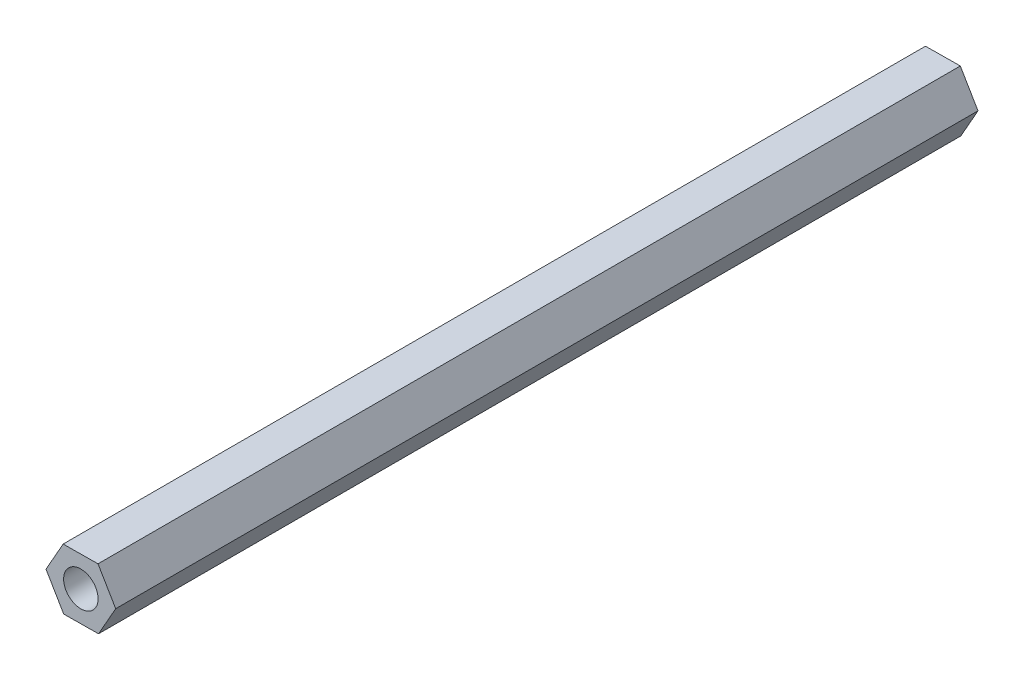
ISO-10303-21;
HEADER;
FILE_DESCRIPTION(('STEP AP214'),'2;1');
FILE_NAME('part.step','',(''),(''),'','','');
FILE_SCHEMA(('AUTOMOTIVE_DESIGN { 1 0 10303 214 1 1 1 1 }'));
ENDSEC;
DATA;
#1=APPLICATION_CONTEXT('core data for automotive mechanical design processes');
#2=APPLICATION_PROTOCOL_DEFINITION('international standard','automotive_design',2000,#1);
#3=PRODUCT_CONTEXT('',#1,'mechanical');
#4=PRODUCT('Part','Part','',(#3));
#5=PRODUCT_RELATED_PRODUCT_CATEGORY('part','',(#4));
#6=PRODUCT_DEFINITION_FORMATION('','',#4);
#7=PRODUCT_DEFINITION_CONTEXT('part definition',#1,'design');
#8=PRODUCT_DEFINITION('design','',#6,#7);
#9=PRODUCT_DEFINITION_SHAPE('','',#8);
#10=(LENGTH_UNIT() NAMED_UNIT(*) SI_UNIT(.MILLI.,.METRE.));
#11=(NAMED_UNIT(*) PLANE_ANGLE_UNIT() SI_UNIT($,.RADIAN.));
#12=(NAMED_UNIT(*) SI_UNIT($,.STERADIAN.) SOLID_ANGLE_UNIT());
#13=UNCERTAINTY_MEASURE_WITH_UNIT(LENGTH_MEASURE(1.E-05),#10,'distance_accuracy_value','');
#14=(GEOMETRIC_REPRESENTATION_CONTEXT(3) GLOBAL_UNCERTAINTY_ASSIGNED_CONTEXT((#13)) GLOBAL_UNIT_ASSIGNED_CONTEXT((#10,
#11,#12)) REPRESENTATION_CONTEXT('',''));
#15=CARTESIAN_POINT('',(0.,0.,0.));
#16=DIRECTION('',(0.,0.,1.));
#17=DIRECTION('',(1.,0.,0.));
#18=AXIS2_PLACEMENT_3D('',#15,#16,#17);
#19=CARTESIAN_POINT('',(0.,0.,100.));
#20=DIRECTION('',(0.,0.,1.));
#21=DIRECTION('',(1.,0.,0.));
#22=AXIS2_PLACEMENT_3D('',#19,#20,#21);
#23=PLANE('',#22);
#24=DIRECTION('',(0.999961257640527,0.00880245522430722,0.));
#25=VECTOR('',#24,1.);
#26=CARTESIAN_POINT('',(-1.98983906118775,-3.51765175136834,100.));
#27=LINE('',#26,#25);
#28=CARTESIAN_POINT('',(-1.98983906118775,-3.51765175136834,100.));
#29=VERTEX_POINT('',#28);
#30=CARTESIAN_POINT('',(2.05145624775792,-3.48207705211536,100.));
#31=VERTEX_POINT('',#30);
#32=EDGE_CURVE('E146',#29,#31,#27,.T.);
#33=ORIENTED_EDGE('',*,*,#32,.T.);
#34=DIRECTION('',(0.492357478980338,0.870393079529086,0.));
#35=VECTOR('',#34,1.);
#36=CARTESIAN_POINT('',(2.05145624775792,-3.48207705211536,100.));
#37=LINE('',#36,#35);
#38=CARTESIAN_POINT('',(4.04129530894568,0.0355746992529791,100.));
#39=VERTEX_POINT('',#38);
#40=EDGE_CURVE('E94',#31,#39,#37,.T.);
#41=ORIENTED_EDGE('',*,*,#40,.T.);
#42=DIRECTION('',(-0.507603778660189,0.861590624304779,0.));
#43=VECTOR('',#42,1.);
#44=CARTESIAN_POINT('',(4.04129530894568,0.0355746992529791,100.));
#45=LINE('',#44,#43);
#46=CARTESIAN_POINT('',(1.98983906118776,3.51765175136834,100.));
#47=VERTEX_POINT('',#46);
#48=EDGE_CURVE('E107',#39,#47,#45,.T.);
#49=ORIENTED_EDGE('',*,*,#48,.T.);
#50=DIRECTION('',(-0.999961257640527,-0.00880245522430723,0.));
#51=VECTOR('',#50,1.);
#52=CARTESIAN_POINT('',(1.98983906118776,3.51765175136834,100.));
#53=LINE('',#52,#51);
#54=CARTESIAN_POINT('',(-2.05145624775791,3.48207705211536,100.));
#55=VERTEX_POINT('',#54);
#56=EDGE_CURVE('E101',#47,#55,#53,.T.);
#57=ORIENTED_EDGE('',*,*,#56,.T.);
#58=DIRECTION('',(-0.492357478980338,-0.870393079529086,0.));
#59=VECTOR('',#58,1.);
#60=CARTESIAN_POINT('',(-2.05145624775791,3.48207705211536,100.));
#61=LINE('',#60,#59);
#62=CARTESIAN_POINT('',(-4.04129530894568,-0.0355746992529825,100.));
#63=VERTEX_POINT('',#62);
#64=EDGE_CURVE('E105',#55,#63,#61,.T.);
#65=ORIENTED_EDGE('',*,*,#64,.T.);
#66=DIRECTION('',(0.507603778660189,-0.861590624304779,0.));
#67=VECTOR('',#66,1.);
#68=CARTESIAN_POINT('',(-4.04129530894568,-0.0355746992529825,100.));
#69=LINE('',#68,#67);
#70=EDGE_CURVE('E57',#63,#29,#69,.T.);
#71=ORIENTED_EDGE('',*,*,#70,.T.);
#72=EDGE_LOOP('',(#33,#41,#49,#57,#65,#71));
#73=FACE_BOUND('',#72,.T.);
#74=CARTESIAN_POINT('',(0.,0.,100.));
#75=DIRECTION('',(0.,0.,1.));
#76=DIRECTION('',(1.,0.,0.));
#77=AXIS2_PLACEMENT_3D('',#74,#75,#76);
#78=CIRCLE('',#77,2.);
#79=CARTESIAN_POINT('',(2.,0.,100.));
#80=VERTEX_POINT('',#79);
#81=EDGE_CURVE('E134',#80,#80,#78,.T.);
#82=ORIENTED_EDGE('',*,*,#81,.F.);
#83=EDGE_LOOP('',(#82));
#84=FACE_BOUND('',#83,.T.);
#85=ADVANCED_FACE('F39',(#73,#84),#23,.T.);
#86=CARTESIAN_POINT('',(0.,0.,0.));
#87=DIRECTION('',(0.,0.,1.));
#88=DIRECTION('',(1.,0.,0.));
#89=AXIS2_PLACEMENT_3D('',#86,#87,#88);
#90=PLANE('',#89);
#91=DIRECTION('',(0.999961257640527,0.00880245522430722,0.));
#92=VECTOR('',#91,1.);
#93=CARTESIAN_POINT('',(-1.98983906118775,-3.51765175136834,0.));
#94=LINE('',#93,#92);
#95=CARTESIAN_POINT('',(-1.98983906118775,-3.51765175136834,0.));
#96=VERTEX_POINT('',#95);
#97=CARTESIAN_POINT('',(2.05145624775792,-3.48207705211536,0.));
#98=VERTEX_POINT('',#97);
#99=EDGE_CURVE('E129',#96,#98,#94,.T.);
#100=ORIENTED_EDGE('',*,*,#99,.F.);
#101=DIRECTION('',(0.507603778660189,-0.861590624304779,0.));
#102=VECTOR('',#101,1.);
#103=CARTESIAN_POINT('',(-4.04129530894568,-0.0355746992529825,0.));
#104=LINE('',#103,#102);
#105=CARTESIAN_POINT('',(-4.04129530894568,-0.0355746992529825,0.));
#106=VERTEX_POINT('',#105);
#107=EDGE_CURVE('E86',#106,#96,#104,.T.);
#108=ORIENTED_EDGE('',*,*,#107,.F.);
#109=DIRECTION('',(-0.492357478980338,-0.870393079529086,0.));
#110=VECTOR('',#109,1.);
#111=CARTESIAN_POINT('',(-2.05145624775791,3.48207705211536,0.));
#112=LINE('',#111,#110);
#113=CARTESIAN_POINT('',(-2.05145624775791,3.48207705211536,0.));
#114=VERTEX_POINT('',#113);
#115=EDGE_CURVE('E80',#114,#106,#112,.T.);
#116=ORIENTED_EDGE('',*,*,#115,.F.);
#117=DIRECTION('',(-0.999961257640527,-0.00880245522430723,0.));
#118=VECTOR('',#117,1.);
#119=CARTESIAN_POINT('',(1.98983906118776,3.51765175136834,0.));
#120=LINE('',#119,#118);
#121=CARTESIAN_POINT('',(1.98983906118776,3.51765175136834,0.));
#122=VERTEX_POINT('',#121);
#123=EDGE_CURVE('E116',#122,#114,#120,.T.);
#124=ORIENTED_EDGE('',*,*,#123,.F.);
#125=DIRECTION('',(-0.507603778660189,0.861590624304779,0.));
#126=VECTOR('',#125,1.);
#127=CARTESIAN_POINT('',(4.04129530894568,0.0355746992529791,0.));
#128=LINE('',#127,#126);
#129=CARTESIAN_POINT('',(4.04129530894568,0.0355746992529791,0.));
#130=VERTEX_POINT('',#129);
#131=EDGE_CURVE('E137',#130,#122,#128,.T.);
#132=ORIENTED_EDGE('',*,*,#131,.F.);
#133=DIRECTION('',(0.492357478980338,0.870393079529086,0.));
#134=VECTOR('',#133,1.);
#135=CARTESIAN_POINT('',(2.05145624775792,-3.48207705211536,0.));
#136=LINE('',#135,#134);
#137=EDGE_CURVE('E133',#98,#130,#136,.T.);
#138=ORIENTED_EDGE('',*,*,#137,.F.);
#139=EDGE_LOOP('',(#100,#108,#116,#124,#132,#138));
#140=FACE_BOUND('',#139,.T.);
#141=CARTESIAN_POINT('',(0.,0.,0.));
#142=DIRECTION('',(0.,0.,1.));
#143=DIRECTION('',(1.,0.,0.));
#144=AXIS2_PLACEMENT_3D('',#141,#142,#143);
#145=CIRCLE('',#144,2.);
#146=CARTESIAN_POINT('',(2.,0.,0.));
#147=VERTEX_POINT('',#146);
#148=EDGE_CURVE('E243',#147,#147,#145,.T.);
#149=ORIENTED_EDGE('',*,*,#148,.T.);
#150=EDGE_LOOP('',(#149));
#151=FACE_BOUND('',#150,.T.);
#152=ADVANCED_FACE('F159',(#140,#151),#90,.F.);
#153=CARTESIAN_POINT('',(-1.98983906118775,-3.51765175136834,100.));
#154=DIRECTION('',(-0.00880245522430722,0.999961257640527,0.));
#155=DIRECTION('',(-0.999961257640527,-0.00880245522430722,0.));
#156=AXIS2_PLACEMENT_3D('',#153,#154,#155);
#157=PLANE('',#156);
#158=ORIENTED_EDGE('',*,*,#99,.T.);
#159=DIRECTION('',(0.,0.,-1.));
#160=VECTOR('',#159,1.);
#161=CARTESIAN_POINT('',(2.05145624775792,-3.48207705211536,100.));
#162=LINE('',#161,#160);
#163=EDGE_CURVE('E11',#31,#98,#162,.T.);
#164=ORIENTED_EDGE('',*,*,#163,.F.);
#165=ORIENTED_EDGE('',*,*,#32,.F.);
#166=DIRECTION('',(0.,0.,-1.));
#167=VECTOR('',#166,1.);
#168=CARTESIAN_POINT('',(-1.98983906118775,-3.51765175136834,100.));
#169=LINE('',#168,#167);
#170=EDGE_CURVE('E125',#29,#96,#169,.T.);
#171=ORIENTED_EDGE('',*,*,#170,.T.);
#172=EDGE_LOOP('',(#158,#164,#165,#171));
#173=FACE_BOUND('',#172,.T.);
#174=ADVANCED_FACE('F41',(#173),#157,.F.);
#175=CARTESIAN_POINT('',(2.05145624775792,-3.48207705211536,100.));
#176=DIRECTION('',(-0.870393079529086,0.492357478980338,0.));
#177=DIRECTION('',(-0.492357478980338,-0.870393079529086,0.));
#178=AXIS2_PLACEMENT_3D('',#175,#176,#177);
#179=PLANE('',#178);
#180=ORIENTED_EDGE('',*,*,#137,.T.);
#181=DIRECTION('',(0.,0.,-1.));
#182=VECTOR('',#181,1.);
#183=CARTESIAN_POINT('',(4.04129530894568,0.0355746992529791,100.));
#184=LINE('',#183,#182);
#185=EDGE_CURVE('E49',#39,#130,#184,.T.);
#186=ORIENTED_EDGE('',*,*,#185,.F.);
#187=ORIENTED_EDGE('',*,*,#40,.F.);
#188=ORIENTED_EDGE('',*,*,#163,.T.);
#189=EDGE_LOOP('',(#180,#186,#187,#188));
#190=FACE_BOUND('',#189,.T.);
#191=ADVANCED_FACE('F184',(#190),#179,.F.);
#192=CARTESIAN_POINT('',(4.04129530894568,0.0355746992529791,100.));
#193=DIRECTION('',(-0.861590624304779,-0.507603778660189,0.));
#194=DIRECTION('',(0.507603778660189,-0.861590624304779,0.));
#195=AXIS2_PLACEMENT_3D('',#192,#193,#194);
#196=PLANE('',#195);
#197=ORIENTED_EDGE('',*,*,#131,.T.);
#198=DIRECTION('',(0.,0.,-1.));
#199=VECTOR('',#198,1.);
#200=CARTESIAN_POINT('',(1.98983906118776,3.51765175136834,100.));
#201=LINE('',#200,#199);
#202=EDGE_CURVE('E118',#47,#122,#201,.T.);
#203=ORIENTED_EDGE('',*,*,#202,.F.);
#204=ORIENTED_EDGE('',*,*,#48,.F.);
#205=ORIENTED_EDGE('',*,*,#185,.T.);
#206=EDGE_LOOP('',(#197,#203,#204,#205));
#207=FACE_BOUND('',#206,.T.);
#208=ADVANCED_FACE('F156',(#207),#196,.F.);
#209=CARTESIAN_POINT('',(1.98983906118776,3.51765175136834,100.));
#210=DIRECTION('',(0.00880245522430723,-0.999961257640527,0.));
#211=DIRECTION('',(0.999961257640527,0.00880245522430723,0.));
#212=AXIS2_PLACEMENT_3D('',#209,#210,#211);
#213=PLANE('',#212);
#214=ORIENTED_EDGE('',*,*,#123,.T.);
#215=DIRECTION('',(0.,0.,-1.));
#216=VECTOR('',#215,1.);
#217=CARTESIAN_POINT('',(-2.05145624775791,3.48207705211536,100.));
#218=LINE('',#217,#216);
#219=EDGE_CURVE('E113',#55,#114,#218,.T.);
#220=ORIENTED_EDGE('',*,*,#219,.F.);
#221=ORIENTED_EDGE('',*,*,#56,.F.);
#222=ORIENTED_EDGE('',*,*,#202,.T.);
#223=EDGE_LOOP('',(#214,#220,#221,#222));
#224=FACE_BOUND('',#223,.T.);
#225=ADVANCED_FACE('F114',(#224),#213,.F.);
#226=CARTESIAN_POINT('',(-2.05145624775791,3.48207705211536,100.));
#227=DIRECTION('',(0.870393079529086,-0.492357478980338,0.));
#228=DIRECTION('',(0.492357478980338,0.870393079529086,0.));
#229=AXIS2_PLACEMENT_3D('',#226,#227,#228);
#230=PLANE('',#229);
#231=ORIENTED_EDGE('',*,*,#115,.T.);
#232=DIRECTION('',(0.,0.,-1.));
#233=VECTOR('',#232,1.);
#234=CARTESIAN_POINT('',(-4.04129530894568,-0.0355746992529825,100.));
#235=LINE('',#234,#233);
#236=EDGE_CURVE('E119',#63,#106,#235,.T.);
#237=ORIENTED_EDGE('',*,*,#236,.F.);
#238=ORIENTED_EDGE('',*,*,#64,.F.);
#239=ORIENTED_EDGE('',*,*,#219,.T.);
#240=EDGE_LOOP('',(#231,#237,#238,#239));
#241=FACE_BOUND('',#240,.T.);
#242=ADVANCED_FACE('F121',(#241),#230,.F.);
#243=CARTESIAN_POINT('',(-4.04129530894568,-0.0355746992529825,100.));
#244=DIRECTION('',(0.861590624304779,0.507603778660189,0.));
#245=DIRECTION('',(-0.507603778660189,0.861590624304779,0.));
#246=AXIS2_PLACEMENT_3D('',#243,#244,#245);
#247=PLANE('',#246);
#248=ORIENTED_EDGE('',*,*,#107,.T.);
#249=ORIENTED_EDGE('',*,*,#170,.F.);
#250=ORIENTED_EDGE('',*,*,#70,.F.);
#251=ORIENTED_EDGE('',*,*,#236,.T.);
#252=EDGE_LOOP('',(#248,#249,#250,#251));
#253=FACE_BOUND('',#252,.T.);
#254=ADVANCED_FACE('F164',(#253),#247,.F.);
#255=CARTESIAN_POINT('',(0.,0.,100.));
#256=DIRECTION('',(0.,0.,-1.));
#257=DIRECTION('',(-1.,0.,0.));
#258=AXIS2_PLACEMENT_3D('',#255,#256,#257);
#259=CYLINDRICAL_SURFACE('',#258,2.);
#260=ORIENTED_EDGE('',*,*,#81,.T.);
#261=EDGE_LOOP('',(#260));
#262=FACE_BOUND('',#261,.T.);
#263=ORIENTED_EDGE('',*,*,#148,.F.);
#264=EDGE_LOOP('',(#263));
#265=FACE_BOUND('',#264,.T.);
#266=ADVANCED_FACE('F166',(#262,#265),#259,.F.);
#267=CLOSED_SHELL('',(#85,#152,#174,#191,#208,#225,#242,#254,#266));
#268=MANIFOLD_SOLID_BREP('B2',#267);
#269=ADVANCED_BREP_SHAPE_REPRESENTATION('',(#18,#268),#14);
#270=SHAPE_DEFINITION_REPRESENTATION(#9,#269);
ENDSEC;
END-ISO-10303-21;
